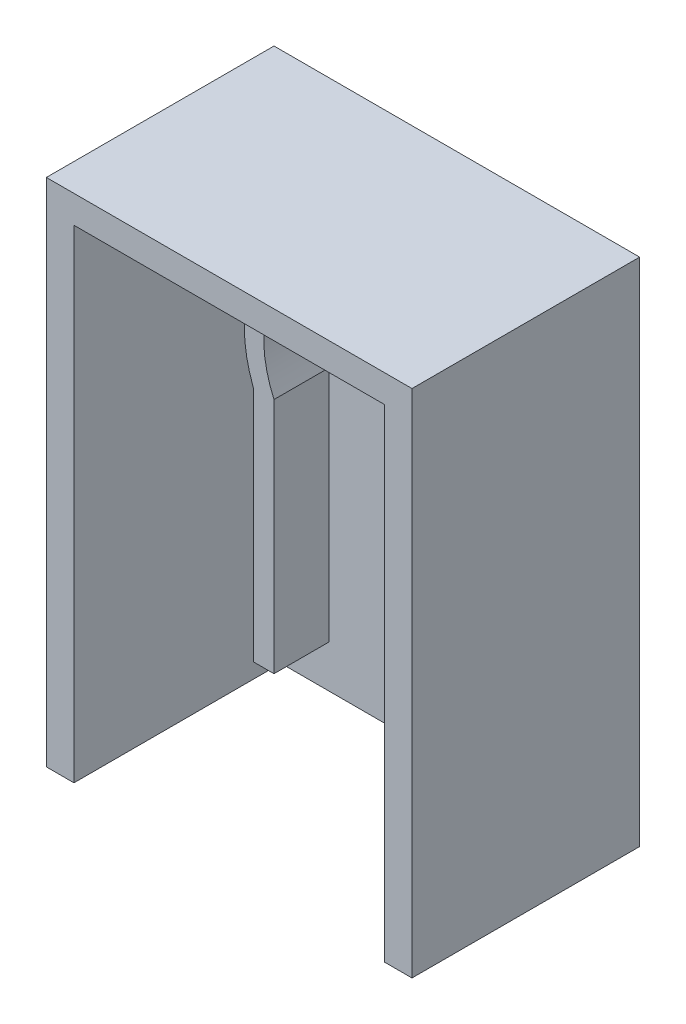
ISO-10303-21;
HEADER;
FILE_DESCRIPTION(('STEP AP214'),'2;1');
FILE_NAME('part.step','',(''),(''),'','','');
FILE_SCHEMA(('AUTOMOTIVE_DESIGN { 1 0 10303 214 1 1 1 1 }'));
ENDSEC;
DATA;
#1=APPLICATION_CONTEXT('core data for automotive mechanical design processes');
#2=APPLICATION_PROTOCOL_DEFINITION('international standard','automotive_design',2000,#1);
#3=PRODUCT_CONTEXT('',#1,'mechanical');
#4=PRODUCT('Part','Part','',(#3));
#5=PRODUCT_RELATED_PRODUCT_CATEGORY('part','',(#4));
#6=PRODUCT_DEFINITION_FORMATION('','',#4);
#7=PRODUCT_DEFINITION_CONTEXT('part definition',#1,'design');
#8=PRODUCT_DEFINITION('design','',#6,#7);
#9=PRODUCT_DEFINITION_SHAPE('','',#8);
#10=(LENGTH_UNIT() NAMED_UNIT(*) SI_UNIT(.MILLI.,.METRE.));
#11=(NAMED_UNIT(*) PLANE_ANGLE_UNIT() SI_UNIT($,.RADIAN.));
#12=(NAMED_UNIT(*) SI_UNIT($,.STERADIAN.) SOLID_ANGLE_UNIT());
#13=UNCERTAINTY_MEASURE_WITH_UNIT(LENGTH_MEASURE(1.E-05),#10,'distance_accuracy_value','');
#14=(GEOMETRIC_REPRESENTATION_CONTEXT(3) GLOBAL_UNCERTAINTY_ASSIGNED_CONTEXT((#13)) GLOBAL_UNIT_ASSIGNED_CONTEXT((#10,
#11,#12)) REPRESENTATION_CONTEXT('',''));
#15=CARTESIAN_POINT('',(0.,0.,0.));
#16=DIRECTION('',(0.,0.,1.));
#17=DIRECTION('',(1.,0.,0.));
#18=AXIS2_PLACEMENT_3D('',#15,#16,#17);
#19=CARTESIAN_POINT('',(0.,0.,0.));
#20=DIRECTION('',(0.,0.,1.));
#21=DIRECTION('',(1.,0.,0.));
#22=AXIS2_PLACEMENT_3D('',#19,#20,#21);
#23=PLANE('',#22);
#24=CARTESIAN_POINT('',(0.,0.0552173561245853,0.));
#25=DIRECTION('',(0.,0.,1.));
#26=DIRECTION('',(1.,0.,0.));
#27=AXIS2_PLACEMENT_3D('',#24,#25,#26);
#28=CIRCLE('',#27,9.90649197063069);
#29=CARTESIAN_POINT('',(9.25,-3.49106001094224,0.));
#30=VERTEX_POINT('',#29);
#31=CARTESIAN_POINT('',(-9.25,-3.49106001094224,0.));
#32=VERTEX_POINT('',#31);
#33=EDGE_CURVE('E242',#30,#32,#28,.T.);
#34=ORIENTED_EDGE('',*,*,#33,.F.);
#35=DIRECTION('',(0.,1.,0.));
#36=VECTOR('',#35,1.);
#37=CARTESIAN_POINT('',(9.25,-20.7024030311517,0.));
#38=LINE('',#37,#36);
#39=CARTESIAN_POINT('',(9.25,-20.7024030311517,0.));
#40=VERTEX_POINT('',#39);
#41=EDGE_CURVE('E250',#40,#30,#38,.T.);
#42=ORIENTED_EDGE('',*,*,#41,.F.);
#43=DIRECTION('',(1.,0.,0.));
#44=VECTOR('',#43,1.);
#45=CARTESIAN_POINT('',(9.25,-20.7024030311517,0.));
#46=LINE('',#45,#44);
#47=CARTESIAN_POINT('',(7.75,-20.7024030311517,0.));
#48=VERTEX_POINT('',#47);
#49=EDGE_CURVE('E295',#48,#40,#46,.T.);
#50=ORIENTED_EDGE('',*,*,#49,.F.);
#51=DIRECTION('',(0.,-1.,0.));
#52=VECTOR('',#51,1.);
#53=CARTESIAN_POINT('',(7.75,-20.7024030311517,0.));
#54=LINE('',#53,#52);
#55=CARTESIAN_POINT('',(7.75,-3.49106001094223,0.));
#56=VERTEX_POINT('',#55);
#57=EDGE_CURVE('E291',#56,#48,#54,.T.);
#58=ORIENTED_EDGE('',*,*,#57,.F.);
#59=CARTESIAN_POINT('',(0.,0.,0.));
#60=DIRECTION('',(0.,0.,-1.));
#61=DIRECTION('',(-1.,0.,0.));
#62=AXIS2_PLACEMENT_3D('',#59,#60,#61);
#63=CIRCLE('',#62,8.5);
#64=CARTESIAN_POINT('',(-7.75,-3.49106001094224,0.));
#65=VERTEX_POINT('',#64);
#66=EDGE_CURVE('E287',#65,#56,#63,.T.);
#67=ORIENTED_EDGE('',*,*,#66,.F.);
#68=DIRECTION('',(0.,1.,0.));
#69=VECTOR('',#68,1.);
#70=CARTESIAN_POINT('',(-7.75,-19.2024030311517,0.));
#71=LINE('',#70,#69);
#72=CARTESIAN_POINT('',(-7.75,-20.7024030311517,0.));
#73=VERTEX_POINT('',#72);
#74=EDGE_CURVE('E283',#73,#65,#71,.T.);
#75=ORIENTED_EDGE('',*,*,#74,.F.);
#76=DIRECTION('',(1.,0.,0.));
#77=VECTOR('',#76,1.);
#78=CARTESIAN_POINT('',(-7.75,-20.7024030311517,0.));
#79=LINE('',#78,#77);
#80=CARTESIAN_POINT('',(-9.25,-20.7024030311517,0.));
#81=VERTEX_POINT('',#80);
#82=EDGE_CURVE('E279',#81,#73,#79,.T.);
#83=ORIENTED_EDGE('',*,*,#82,.F.);
#84=DIRECTION('',(0.,-1.,0.));
#85=VECTOR('',#84,1.);
#86=CARTESIAN_POINT('',(-9.25,-3.49106001094224,0.));
#87=LINE('',#86,#85);
#88=EDGE_CURVE('E275',#32,#81,#87,.T.);
#89=ORIENTED_EDGE('',*,*,#88,.F.);
#90=EDGE_LOOP('',(#34,#42,#50,#58,#67,#75,#83,#89));
#91=FACE_BOUND('',#90,.T.);
#92=DIRECTION('',(1.,0.,0.));
#93=VECTOR('',#92,1.);
#94=CARTESIAN_POINT('',(-11.25,11.2,0.));
#95=LINE('',#94,#93);
#96=CARTESIAN_POINT('',(-11.25,11.2,0.));
#97=VERTEX_POINT('',#96);
#98=CARTESIAN_POINT('',(11.25,11.2,0.));
#99=VERTEX_POINT('',#98);
#100=EDGE_CURVE('E55',#97,#99,#95,.T.);
#101=ORIENTED_EDGE('',*,*,#100,.F.);
#102=DIRECTION('',(0.,1.,0.));
#103=VECTOR('',#102,1.);
#104=CARTESIAN_POINT('',(-11.25,-23.8,0.));
#105=LINE('',#104,#103);
#106=CARTESIAN_POINT('',(-11.25,-23.8,0.));
#107=VERTEX_POINT('',#106);
#108=EDGE_CURVE('E203',#107,#97,#105,.T.);
#109=ORIENTED_EDGE('',*,*,#108,.F.);
#110=DIRECTION('',(1.,0.,0.));
#111=VECTOR('',#110,1.);
#112=CARTESIAN_POINT('',(-11.25,-23.8,0.));
#113=LINE('',#112,#111);
#114=CARTESIAN_POINT('',(11.25,-23.8,0.));
#115=VERTEX_POINT('',#114);
#116=EDGE_CURVE('E161',#107,#115,#113,.T.);
#117=ORIENTED_EDGE('',*,*,#116,.T.);
#118=DIRECTION('',(0.,-1.,0.));
#119=VECTOR('',#118,1.);
#120=CARTESIAN_POINT('',(11.25,11.2,0.));
#121=LINE('',#120,#119);
#122=EDGE_CURVE('E60',#99,#115,#121,.T.);
#123=ORIENTED_EDGE('',*,*,#122,.F.);
#124=EDGE_LOOP('',(#101,#109,#117,#123));
#125=FACE_BOUND('',#124,.T.);
#126=ADVANCED_FACE('F39',(#91,#125),#23,.T.);
#127=CARTESIAN_POINT('',(0.,0.0552173561245853,4.));
#128=DIRECTION('',(0.,0.,-1.));
#129=DIRECTION('',(-1.,0.,0.));
#130=AXIS2_PLACEMENT_3D('',#127,#128,#129);
#131=CYLINDRICAL_SURFACE('',#130,9.90649197063069);
#132=ORIENTED_EDGE('',*,*,#33,.T.);
#133=DIRECTION('',(0.,0.,-1.));
#134=VECTOR('',#133,1.);
#135=CARTESIAN_POINT('',(-9.25,-3.49106001094224,4.));
#136=LINE('',#135,#134);
#137=CARTESIAN_POINT('',(-9.25,-3.49106001094224,4.));
#138=VERTEX_POINT('',#137);
#139=EDGE_CURVE('E11',#138,#32,#136,.T.);
#140=ORIENTED_EDGE('',*,*,#139,.F.);
#141=CARTESIAN_POINT('',(0.,0.0552173561245853,4.));
#142=DIRECTION('',(0.,0.,1.));
#143=DIRECTION('',(1.,0.,0.));
#144=AXIS2_PLACEMENT_3D('',#141,#142,#143);
#145=CIRCLE('',#144,9.90649197063069);
#146=CARTESIAN_POINT('',(9.25,-3.49106001094224,4.));
#147=VERTEX_POINT('',#146);
#148=EDGE_CURVE('E245',#147,#138,#145,.T.);
#149=ORIENTED_EDGE('',*,*,#148,.F.);
#150=DIRECTION('',(0.,0.,-1.));
#151=VECTOR('',#150,1.);
#152=CARTESIAN_POINT('',(9.25,-3.49106001094224,4.));
#153=LINE('',#152,#151);
#154=EDGE_CURVE('E271',#147,#30,#153,.T.);
#155=ORIENTED_EDGE('',*,*,#154,.T.);
#156=EDGE_LOOP('',(#132,#140,#149,#155));
#157=FACE_BOUND('',#156,.T.);
#158=ADVANCED_FACE('F41',(#157),#131,.T.);
#159=CARTESIAN_POINT('',(-9.25,-3.49106001094224,4.));
#160=DIRECTION('',(1.,0.,0.));
#161=DIRECTION('',(0.,1.,0.));
#162=AXIS2_PLACEMENT_3D('',#159,#160,#161);
#163=PLANE('',#162);
#164=ORIENTED_EDGE('',*,*,#88,.T.);
#165=DIRECTION('',(0.,0.,-1.));
#166=VECTOR('',#165,1.);
#167=CARTESIAN_POINT('',(-9.25,-20.7024030311517,4.));
#168=LINE('',#167,#166);
#169=CARTESIAN_POINT('',(-9.25,-20.7024030311517,4.));
#170=VERTEX_POINT('',#169);
#171=EDGE_CURVE('E48',#170,#81,#168,.T.);
#172=ORIENTED_EDGE('',*,*,#171,.F.);
#173=DIRECTION('',(0.,-1.,0.));
#174=VECTOR('',#173,1.);
#175=CARTESIAN_POINT('',(-9.25,-3.49106001094224,4.));
#176=LINE('',#175,#174);
#177=EDGE_CURVE('E249',#138,#170,#176,.T.);
#178=ORIENTED_EDGE('',*,*,#177,.F.);
#179=ORIENTED_EDGE('',*,*,#139,.T.);
#180=EDGE_LOOP('',(#164,#172,#178,#179));
#181=FACE_BOUND('',#180,.T.);
#182=ADVANCED_FACE('F332',(#181),#163,.F.);
#183=CARTESIAN_POINT('',(-7.75,-20.7024030311517,4.));
#184=DIRECTION('',(0.,1.,0.));
#185=DIRECTION('',(0.,0.,1.));
#186=AXIS2_PLACEMENT_3D('',#183,#184,#185);
#187=PLANE('',#186);
#188=ORIENTED_EDGE('',*,*,#82,.T.);
#189=DIRECTION('',(0.,0.,-1.));
#190=VECTOR('',#189,1.);
#191=CARTESIAN_POINT('',(-7.75,-20.7024030311517,4.));
#192=LINE('',#191,#190);
#193=CARTESIAN_POINT('',(-7.75,-20.7024030311517,4.));
#194=VERTEX_POINT('',#193);
#195=EDGE_CURVE('E321',#194,#73,#192,.T.);
#196=ORIENTED_EDGE('',*,*,#195,.F.);
#197=DIRECTION('',(1.,0.,0.));
#198=VECTOR('',#197,1.);
#199=CARTESIAN_POINT('',(-7.75,-20.7024030311517,4.));
#200=LINE('',#199,#198);
#201=EDGE_CURVE('E253',#170,#194,#200,.T.);
#202=ORIENTED_EDGE('',*,*,#201,.F.);
#203=ORIENTED_EDGE('',*,*,#171,.T.);
#204=EDGE_LOOP('',(#188,#196,#202,#203));
#205=FACE_BOUND('',#204,.T.);
#206=ADVANCED_FACE('F329',(#205),#187,.F.);
#207=CARTESIAN_POINT('',(-7.75,-19.2024030311517,4.));
#208=DIRECTION('',(-1.,0.,0.));
#209=DIRECTION('',(0.,0.,1.));
#210=AXIS2_PLACEMENT_3D('',#207,#208,#209);
#211=PLANE('',#210);
#212=ORIENTED_EDGE('',*,*,#74,.T.);
#213=DIRECTION('',(0.,0.,-1.));
#214=VECTOR('',#213,1.);
#215=CARTESIAN_POINT('',(-7.75,-3.49106001094224,4.));
#216=LINE('',#215,#214);
#217=CARTESIAN_POINT('',(-7.75,-3.49106001094224,4.));
#218=VERTEX_POINT('',#217);
#219=EDGE_CURVE('E317',#218,#65,#216,.T.);
#220=ORIENTED_EDGE('',*,*,#219,.F.);
#221=DIRECTION('',(0.,1.,0.));
#222=VECTOR('',#221,1.);
#223=CARTESIAN_POINT('',(-7.75,-19.2024030311517,4.));
#224=LINE('',#223,#222);
#225=EDGE_CURVE('E256',#194,#218,#224,.T.);
#226=ORIENTED_EDGE('',*,*,#225,.F.);
#227=ORIENTED_EDGE('',*,*,#195,.T.);
#228=EDGE_LOOP('',(#212,#220,#226,#227));
#229=FACE_BOUND('',#228,.T.);
#230=ADVANCED_FACE('F337',(#229),#211,.F.);
#231=CARTESIAN_POINT('',(0.,0.,4.));
#232=DIRECTION('',(0.,0.,-1.));
#233=DIRECTION('',(-1.,0.,0.));
#234=AXIS2_PLACEMENT_3D('',#231,#232,#233);
#235=CYLINDRICAL_SURFACE('',#234,8.5);
#236=ORIENTED_EDGE('',*,*,#66,.T.);
#237=DIRECTION('',(0.,0.,-1.));
#238=VECTOR('',#237,1.);
#239=CARTESIAN_POINT('',(7.75,-3.49106001094223,4.));
#240=LINE('',#239,#238);
#241=CARTESIAN_POINT('',(7.75,-3.49106001094223,4.));
#242=VERTEX_POINT('',#241);
#243=EDGE_CURVE('E313',#242,#56,#240,.T.);
#244=ORIENTED_EDGE('',*,*,#243,.F.);
#245=CARTESIAN_POINT('',(0.,0.,4.));
#246=DIRECTION('',(0.,0.,-1.));
#247=DIRECTION('',(-1.,0.,0.));
#248=AXIS2_PLACEMENT_3D('',#245,#246,#247);
#249=CIRCLE('',#248,8.5);
#250=EDGE_CURVE('E259',#218,#242,#249,.T.);
#251=ORIENTED_EDGE('',*,*,#250,.F.);
#252=ORIENTED_EDGE('',*,*,#219,.T.);
#253=EDGE_LOOP('',(#236,#244,#251,#252));
#254=FACE_BOUND('',#253,.T.);
#255=ADVANCED_FACE('F341',(#254),#235,.F.);
#256=CARTESIAN_POINT('',(7.75,-20.7024030311517,4.));
#257=DIRECTION('',(1.,0.,0.));
#258=DIRECTION('',(0.,0.,-1.));
#259=AXIS2_PLACEMENT_3D('',#256,#257,#258);
#260=PLANE('',#259);
#261=ORIENTED_EDGE('',*,*,#57,.T.);
#262=DIRECTION('',(0.,0.,-1.));
#263=VECTOR('',#262,1.);
#264=CARTESIAN_POINT('',(7.75,-20.7024030311517,4.));
#265=LINE('',#264,#263);
#266=CARTESIAN_POINT('',(7.75,-20.7024030311517,4.));
#267=VERTEX_POINT('',#266);
#268=EDGE_CURVE('E309',#267,#48,#265,.T.);
#269=ORIENTED_EDGE('',*,*,#268,.F.);
#270=DIRECTION('',(0.,-1.,0.));
#271=VECTOR('',#270,1.);
#272=CARTESIAN_POINT('',(7.75,-19.2024030311517,4.));
#273=LINE('',#272,#271);
#274=EDGE_CURVE('E262',#242,#267,#273,.T.);
#275=ORIENTED_EDGE('',*,*,#274,.F.);
#276=ORIENTED_EDGE('',*,*,#243,.T.);
#277=EDGE_LOOP('',(#261,#269,#275,#276));
#278=FACE_BOUND('',#277,.T.);
#279=ADVANCED_FACE('F358',(#278),#260,.F.);
#280=CARTESIAN_POINT('',(9.25,-20.7024030311517,4.));
#281=DIRECTION('',(0.,1.,0.));
#282=DIRECTION('',(0.,0.,1.));
#283=AXIS2_PLACEMENT_3D('',#280,#281,#282);
#284=PLANE('',#283);
#285=ORIENTED_EDGE('',*,*,#49,.T.);
#286=DIRECTION('',(0.,0.,-1.));
#287=VECTOR('',#286,1.);
#288=CARTESIAN_POINT('',(9.25,-20.7024030311517,4.));
#289=LINE('',#288,#287);
#290=CARTESIAN_POINT('',(9.25,-20.7024030311517,4.));
#291=VERTEX_POINT('',#290);
#292=EDGE_CURVE('E305',#291,#40,#289,.T.);
#293=ORIENTED_EDGE('',*,*,#292,.F.);
#294=DIRECTION('',(1.,0.,0.));
#295=VECTOR('',#294,1.);
#296=CARTESIAN_POINT('',(9.25,-20.7024030311517,4.));
#297=LINE('',#296,#295);
#298=EDGE_CURVE('E265',#267,#291,#297,.T.);
#299=ORIENTED_EDGE('',*,*,#298,.F.);
#300=ORIENTED_EDGE('',*,*,#268,.T.);
#301=EDGE_LOOP('',(#285,#293,#299,#300));
#302=FACE_BOUND('',#301,.T.);
#303=ADVANCED_FACE('F355',(#302),#284,.F.);
#304=CARTESIAN_POINT('',(9.25,-20.7024030311517,4.));
#305=DIRECTION('',(-1.,0.,0.));
#306=DIRECTION('',(0.,0.,1.));
#307=AXIS2_PLACEMENT_3D('',#304,#305,#306);
#308=PLANE('',#307);
#309=ORIENTED_EDGE('',*,*,#41,.T.);
#310=ORIENTED_EDGE('',*,*,#154,.F.);
#311=DIRECTION('',(0.,1.,0.));
#312=VECTOR('',#311,1.);
#313=CARTESIAN_POINT('',(9.25,-20.7024030311517,4.));
#314=LINE('',#313,#312);
#315=EDGE_CURVE('E268',#291,#147,#314,.T.);
#316=ORIENTED_EDGE('',*,*,#315,.F.);
#317=ORIENTED_EDGE('',*,*,#292,.T.);
#318=EDGE_LOOP('',(#309,#310,#316,#317));
#319=FACE_BOUND('',#318,.T.);
#320=ADVANCED_FACE('F352',(#319),#308,.F.);
#321=CARTESIAN_POINT('',(0.,0.0552173561245853,4.));
#322=DIRECTION('',(0.,0.,1.));
#323=DIRECTION('',(1.,0.,0.));
#324=AXIS2_PLACEMENT_3D('',#321,#322,#323);
#325=PLANE('',#324);
#326=ORIENTED_EDGE('',*,*,#148,.T.);
#327=ORIENTED_EDGE('',*,*,#177,.T.);
#328=ORIENTED_EDGE('',*,*,#201,.T.);
#329=ORIENTED_EDGE('',*,*,#225,.T.);
#330=ORIENTED_EDGE('',*,*,#250,.T.);
#331=ORIENTED_EDGE('',*,*,#274,.T.);
#332=ORIENTED_EDGE('',*,*,#298,.T.);
#333=ORIENTED_EDGE('',*,*,#315,.T.);
#334=EDGE_LOOP('',(#326,#327,#328,#329,#330,#331,#332,#333));
#335=FACE_BOUND('',#334,.T.);
#336=ADVANCED_FACE('F345',(#335),#325,.T.);
#337=CARTESIAN_POINT('',(-11.25,-23.8,-1.5));
#338=DIRECTION('',(0.,-1.,0.));
#339=DIRECTION('',(1.,0.,0.));
#340=AXIS2_PLACEMENT_3D('',#337,#338,#339);
#341=PLANE('',#340);
#342=ORIENTED_EDGE('',*,*,#116,.F.);
#343=DIRECTION('',(0.,0.,-1.));
#344=VECTOR('',#343,1.);
#345=CARTESIAN_POINT('',(-11.25,-23.8,15.));
#346=LINE('',#345,#344);
#347=CARTESIAN_POINT('',(-11.25,-23.8,15.));
#348=VERTEX_POINT('',#347);
#349=EDGE_CURVE('E169',#348,#107,#346,.T.);
#350=ORIENTED_EDGE('',*,*,#349,.F.);
#351=DIRECTION('',(1.,0.,0.));
#352=VECTOR('',#351,1.);
#353=CARTESIAN_POINT('',(-13.25,-23.8,15.));
#354=LINE('',#353,#352);
#355=CARTESIAN_POINT('',(-13.25,-23.8,15.));
#356=VERTEX_POINT('',#355);
#357=EDGE_CURVE('E165',#356,#348,#354,.T.);
#358=ORIENTED_EDGE('',*,*,#357,.F.);
#359=DIRECTION('',(0.,0.,1.));
#360=VECTOR('',#359,1.);
#361=CARTESIAN_POINT('',(-13.25,-23.8,-1.5));
#362=LINE('',#361,#360);
#363=CARTESIAN_POINT('',(-13.25,-23.8,-1.5));
#364=VERTEX_POINT('',#363);
#365=EDGE_CURVE('E152',#364,#356,#362,.T.);
#366=ORIENTED_EDGE('',*,*,#365,.F.);
#367=DIRECTION('',(1.,0.,0.));
#368=VECTOR('',#367,1.);
#369=CARTESIAN_POINT('',(-11.25,-23.8,-1.5));
#370=LINE('',#369,#368);
#371=CARTESIAN_POINT('',(13.25,-23.8,-1.5));
#372=VERTEX_POINT('',#371);
#373=EDGE_CURVE('E239',#364,#372,#370,.T.);
#374=ORIENTED_EDGE('',*,*,#373,.T.);
#375=DIRECTION('',(0.,0.,1.));
#376=VECTOR('',#375,1.);
#377=CARTESIAN_POINT('',(13.25,-23.8,-1.5));
#378=LINE('',#377,#376);
#379=CARTESIAN_POINT('',(13.25,-23.8,15.));
#380=VERTEX_POINT('',#379);
#381=EDGE_CURVE('E230',#372,#380,#378,.T.);
#382=ORIENTED_EDGE('',*,*,#381,.T.);
#383=DIRECTION('',(1.,0.,0.));
#384=VECTOR('',#383,1.);
#385=CARTESIAN_POINT('',(13.25,-23.8,15.));
#386=LINE('',#385,#384);
#387=CARTESIAN_POINT('',(11.25,-23.8,15.));
#388=VERTEX_POINT('',#387);
#389=EDGE_CURVE('E193',#388,#380,#386,.T.);
#390=ORIENTED_EDGE('',*,*,#389,.F.);
#391=DIRECTION('',(0.,0.,-1.));
#392=VECTOR('',#391,1.);
#393=CARTESIAN_POINT('',(11.25,-23.8,15.));
#394=LINE('',#393,#392);
#395=EDGE_CURVE('E202',#388,#115,#394,.T.);
#396=ORIENTED_EDGE('',*,*,#395,.T.);
#397=EDGE_LOOP('',(#342,#350,#358,#366,#374,#382,#390,#396));
#398=FACE_BOUND('',#397,.T.);
#399=ADVANCED_FACE('F167',(#398),#341,.T.);
#400=CARTESIAN_POINT('',(0.,0.,-1.5));
#401=DIRECTION('',(0.,0.,1.));
#402=DIRECTION('',(1.,0.,0.));
#403=AXIS2_PLACEMENT_3D('',#400,#401,#402);
#404=PLANE('',#403);
#405=DIRECTION('',(0.,1.,0.));
#406=VECTOR('',#405,1.);
#407=CARTESIAN_POINT('',(13.25,13.2,-1.5));
#408=LINE('',#407,#406);
#409=CARTESIAN_POINT('',(13.25,13.2,-1.5));
#410=VERTEX_POINT('',#409);
#411=EDGE_CURVE('E221',#372,#410,#408,.T.);
#412=ORIENTED_EDGE('',*,*,#411,.F.);
#413=ORIENTED_EDGE('',*,*,#373,.F.);
#414=DIRECTION('',(0.,-1.,0.));
#415=VECTOR('',#414,1.);
#416=CARTESIAN_POINT('',(-13.25,-23.8,-1.5));
#417=LINE('',#416,#415);
#418=CARTESIAN_POINT('',(-13.25,13.2,-1.5));
#419=VERTEX_POINT('',#418);
#420=EDGE_CURVE('E158',#419,#364,#417,.T.);
#421=ORIENTED_EDGE('',*,*,#420,.F.);
#422=DIRECTION('',(-1.,0.,0.));
#423=VECTOR('',#422,1.);
#424=CARTESIAN_POINT('',(-13.25,13.2,-1.5));
#425=LINE('',#424,#423);
#426=EDGE_CURVE('E225',#410,#419,#425,.T.);
#427=ORIENTED_EDGE('',*,*,#426,.F.);
#428=EDGE_LOOP('',(#412,#413,#421,#427));
#429=FACE_BOUND('',#428,.T.);
#430=ADVANCED_FACE('F374',(#429),#404,.F.);
#431=CARTESIAN_POINT('',(-13.25,-23.8,-1.5));
#432=DIRECTION('',(-1.,0.,0.));
#433=DIRECTION('',(0.,0.,1.));
#434=AXIS2_PLACEMENT_3D('',#431,#432,#433);
#435=PLANE('',#434);
#436=ORIENTED_EDGE('',*,*,#365,.T.);
#437=DIRECTION('',(0.,-1.,0.));
#438=VECTOR('',#437,1.);
#439=CARTESIAN_POINT('',(-13.25,13.2,15.));
#440=LINE('',#439,#438);
#441=CARTESIAN_POINT('',(-13.25,13.2,15.));
#442=VERTEX_POINT('',#441);
#443=EDGE_CURVE('E156',#442,#356,#440,.T.);
#444=ORIENTED_EDGE('',*,*,#443,.F.);
#445=DIRECTION('',(0.,0.,1.));
#446=VECTOR('',#445,1.);
#447=CARTESIAN_POINT('',(-13.25,13.2,-1.5));
#448=LINE('',#447,#446);
#449=EDGE_CURVE('E162',#419,#442,#448,.T.);
#450=ORIENTED_EDGE('',*,*,#449,.F.);
#451=ORIENTED_EDGE('',*,*,#420,.T.);
#452=EDGE_LOOP('',(#436,#444,#450,#451));
#453=FACE_BOUND('',#452,.T.);
#454=ADVANCED_FACE('F154',(#453),#435,.T.);
#455=CARTESIAN_POINT('',(-13.25,13.2,-1.5));
#456=DIRECTION('',(0.,1.,0.));
#457=DIRECTION('',(0.,0.,1.));
#458=AXIS2_PLACEMENT_3D('',#455,#456,#457);
#459=PLANE('',#458);
#460=ORIENTED_EDGE('',*,*,#449,.T.);
#461=DIRECTION('',(-1.,0.,0.));
#462=VECTOR('',#461,1.);
#463=CARTESIAN_POINT('',(-13.25,13.2,15.));
#464=LINE('',#463,#462);
#465=CARTESIAN_POINT('',(13.25,13.2,15.));
#466=VERTEX_POINT('',#465);
#467=EDGE_CURVE('E179',#466,#442,#464,.T.);
#468=ORIENTED_EDGE('',*,*,#467,.F.);
#469=DIRECTION('',(0.,0.,1.));
#470=VECTOR('',#469,1.);
#471=CARTESIAN_POINT('',(13.25,13.2,-1.5));
#472=LINE('',#471,#470);
#473=EDGE_CURVE('E234',#410,#466,#472,.T.);
#474=ORIENTED_EDGE('',*,*,#473,.F.);
#475=ORIENTED_EDGE('',*,*,#426,.T.);
#476=EDGE_LOOP('',(#460,#468,#474,#475));
#477=FACE_BOUND('',#476,.T.);
#478=ADVANCED_FACE('F406',(#477),#459,.T.);
#479=CARTESIAN_POINT('',(13.25,13.2,-1.5));
#480=DIRECTION('',(1.,0.,0.));
#481=DIRECTION('',(0.,0.,-1.));
#482=AXIS2_PLACEMENT_3D('',#479,#480,#481);
#483=PLANE('',#482);
#484=ORIENTED_EDGE('',*,*,#473,.T.);
#485=DIRECTION('',(0.,1.,0.));
#486=VECTOR('',#485,1.);
#487=CARTESIAN_POINT('',(13.25,13.2,15.));
#488=LINE('',#487,#486);
#489=EDGE_CURVE('E197',#380,#466,#488,.T.);
#490=ORIENTED_EDGE('',*,*,#489,.F.);
#491=ORIENTED_EDGE('',*,*,#381,.F.);
#492=ORIENTED_EDGE('',*,*,#411,.T.);
#493=EDGE_LOOP('',(#484,#490,#491,#492));
#494=FACE_BOUND('',#493,.T.);
#495=ADVANCED_FACE('F413',(#494),#483,.T.);
#496=CARTESIAN_POINT('',(-11.25,-23.8,15.));
#497=DIRECTION('',(-1.,0.,0.));
#498=DIRECTION('',(0.,-1.,0.));
#499=AXIS2_PLACEMENT_3D('',#496,#497,#498);
#500=PLANE('',#499);
#501=ORIENTED_EDGE('',*,*,#108,.T.);
#502=DIRECTION('',(0.,0.,-1.));
#503=VECTOR('',#502,1.);
#504=CARTESIAN_POINT('',(-11.25,11.2,15.));
#505=LINE('',#504,#503);
#506=CARTESIAN_POINT('',(-11.25,11.2,15.));
#507=VERTEX_POINT('',#506);
#508=EDGE_CURVE('E215',#507,#97,#505,.T.);
#509=ORIENTED_EDGE('',*,*,#508,.F.);
#510=DIRECTION('',(0.,1.,0.));
#511=VECTOR('',#510,1.);
#512=CARTESIAN_POINT('',(-11.25,-23.8,15.));
#513=LINE('',#512,#511);
#514=EDGE_CURVE('E173',#348,#507,#513,.T.);
#515=ORIENTED_EDGE('',*,*,#514,.F.);
#516=ORIENTED_EDGE('',*,*,#349,.T.);
#517=EDGE_LOOP('',(#501,#509,#515,#516));
#518=FACE_BOUND('',#517,.T.);
#519=ADVANCED_FACE('F421',(#518),#500,.F.);
#520=CARTESIAN_POINT('',(-11.25,11.2,15.));
#521=DIRECTION('',(0.,1.,0.));
#522=DIRECTION('',(0.,0.,1.));
#523=AXIS2_PLACEMENT_3D('',#520,#521,#522);
#524=PLANE('',#523);
#525=ORIENTED_EDGE('',*,*,#100,.T.);
#526=DIRECTION('',(0.,0.,-1.));
#527=VECTOR('',#526,1.);
#528=CARTESIAN_POINT('',(11.25,11.2,15.));
#529=LINE('',#528,#527);
#530=CARTESIAN_POINT('',(11.25,11.2,15.));
#531=VERTEX_POINT('',#530);
#532=EDGE_CURVE('E211',#531,#99,#529,.T.);
#533=ORIENTED_EDGE('',*,*,#532,.F.);
#534=DIRECTION('',(1.,0.,0.));
#535=VECTOR('',#534,1.);
#536=CARTESIAN_POINT('',(-11.25,11.2,15.));
#537=LINE('',#536,#535);
#538=EDGE_CURVE('E187',#507,#531,#537,.T.);
#539=ORIENTED_EDGE('',*,*,#538,.F.);
#540=ORIENTED_EDGE('',*,*,#508,.T.);
#541=EDGE_LOOP('',(#525,#533,#539,#540));
#542=FACE_BOUND('',#541,.T.);
#543=ADVANCED_FACE('F428',(#542),#524,.F.);
#544=CARTESIAN_POINT('',(11.25,11.2,15.));
#545=DIRECTION('',(1.,0.,0.));
#546=DIRECTION('',(0.,1.,0.));
#547=AXIS2_PLACEMENT_3D('',#544,#545,#546);
#548=PLANE('',#547);
#549=ORIENTED_EDGE('',*,*,#122,.T.);
#550=ORIENTED_EDGE('',*,*,#395,.F.);
#551=DIRECTION('',(0.,-1.,0.));
#552=VECTOR('',#551,1.);
#553=CARTESIAN_POINT('',(11.25,11.2,15.));
#554=LINE('',#553,#552);
#555=EDGE_CURVE('E190',#531,#388,#554,.T.);
#556=ORIENTED_EDGE('',*,*,#555,.F.);
#557=ORIENTED_EDGE('',*,*,#532,.T.);
#558=EDGE_LOOP('',(#549,#550,#556,#557));
#559=FACE_BOUND('',#558,.T.);
#560=ADVANCED_FACE('F436',(#559),#548,.F.);
#561=CARTESIAN_POINT('',(0.,0.,15.));
#562=DIRECTION('',(0.,0.,1.));
#563=DIRECTION('',(1.,0.,0.));
#564=AXIS2_PLACEMENT_3D('',#561,#562,#563);
#565=PLANE('',#564);
#566=ORIENTED_EDGE('',*,*,#443,.T.);
#567=ORIENTED_EDGE('',*,*,#357,.T.);
#568=ORIENTED_EDGE('',*,*,#514,.T.);
#569=ORIENTED_EDGE('',*,*,#538,.T.);
#570=ORIENTED_EDGE('',*,*,#555,.T.);
#571=ORIENTED_EDGE('',*,*,#389,.T.);
#572=ORIENTED_EDGE('',*,*,#489,.T.);
#573=ORIENTED_EDGE('',*,*,#467,.T.);
#574=EDGE_LOOP('',(#566,#567,#568,#569,#570,#571,#572,#573));
#575=FACE_BOUND('',#574,.T.);
#576=ADVANCED_FACE('F176',(#575),#565,.T.);
#577=CLOSED_SHELL('',(#126,#158,#182,#206,#230,#255,#279,#303,#320,#336,#399,#430,#454,#478,
#495,#519,#543,#560,#576));
#578=MANIFOLD_SOLID_BREP('B2',#577);
#579=ADVANCED_BREP_SHAPE_REPRESENTATION('',(#18,#578),#14);
#580=SHAPE_DEFINITION_REPRESENTATION(#9,#579);
ENDSEC;
END-ISO-10303-21;
